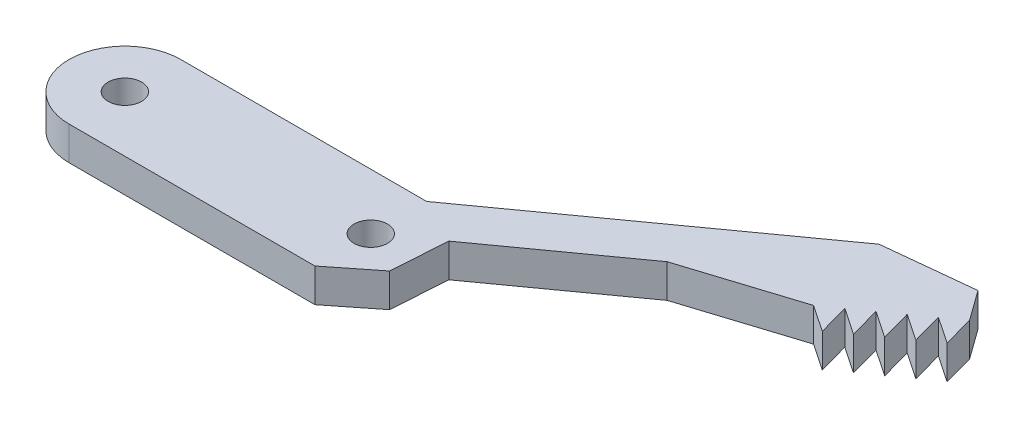
ISO-10303-21;
HEADER;
FILE_DESCRIPTION(('STEP AP214'),'2;1');
FILE_NAME('part.step','',(''),(''),'','','');
FILE_SCHEMA(('AUTOMOTIVE_DESIGN { 1 0 10303 214 1 1 1 1 }'));
ENDSEC;
DATA;
#1=APPLICATION_CONTEXT('core data for automotive mechanical design processes');
#2=APPLICATION_PROTOCOL_DEFINITION('international standard','automotive_design',2000,#1);
#3=PRODUCT_CONTEXT('',#1,'mechanical');
#4=PRODUCT('Part','Part','',(#3));
#5=PRODUCT_RELATED_PRODUCT_CATEGORY('part','',(#4));
#6=PRODUCT_DEFINITION_FORMATION('','',#4);
#7=PRODUCT_DEFINITION_CONTEXT('part definition',#1,'design');
#8=PRODUCT_DEFINITION('design','',#6,#7);
#9=PRODUCT_DEFINITION_SHAPE('','',#8);
#10=(LENGTH_UNIT() NAMED_UNIT(*) SI_UNIT(.MILLI.,.METRE.));
#11=(NAMED_UNIT(*) PLANE_ANGLE_UNIT() SI_UNIT($,.RADIAN.));
#12=(NAMED_UNIT(*) SI_UNIT($,.STERADIAN.) SOLID_ANGLE_UNIT());
#13=UNCERTAINTY_MEASURE_WITH_UNIT(LENGTH_MEASURE(1.E-05),#10,'distance_accuracy_value','');
#14=(GEOMETRIC_REPRESENTATION_CONTEXT(3) GLOBAL_UNCERTAINTY_ASSIGNED_CONTEXT((#13)) GLOBAL_UNIT_ASSIGNED_CONTEXT((#10,
#11,#12)) REPRESENTATION_CONTEXT('',''));
#15=CARTESIAN_POINT('',(0.,0.,0.));
#16=DIRECTION('',(0.,0.,1.));
#17=DIRECTION('',(1.,0.,0.));
#18=AXIS2_PLACEMENT_3D('',#15,#16,#17);
#19=CARTESIAN_POINT('',(-11.,3.,0.));
#20=DIRECTION('',(0.,1.,0.));
#21=DIRECTION('',(0.,0.,1.));
#22=AXIS2_PLACEMENT_3D('',#19,#20,#21);
#23=PLANE('',#22);
#24=DIRECTION('',(-0.783990131924299,0.,0.620773286349631));
#25=VECTOR('',#24,1.);
#26=CARTESIAN_POINT('',(14.7367715637288,3.,2.04117708948695));
#27=LINE('',#26,#25);
#28=CARTESIAN_POINT('',(14.7367715637288,3.,2.04117708948695));
#29=VERTEX_POINT('',#28);
#30=CARTESIAN_POINT('',(11.,3.,5.));
#31=VERTEX_POINT('',#30);
#32=EDGE_CURVE('E213',#29,#31,#27,.T.);
#33=ORIENTED_EDGE('',*,*,#32,.F.);
#34=DIRECTION('',(-0.0650802030381228,0.,0.99788003646356));
#35=VECTOR('',#34,1.);
#36=CARTESIAN_POINT('',(15.0602018848517,3.,-2.91800628070727));
#37=LINE('',#36,#35);
#38=CARTESIAN_POINT('',(15.0602018848517,3.,-2.91800628070727));
#39=VERTEX_POINT('',#38);
#40=EDGE_CURVE('E368',#39,#29,#37,.T.);
#41=ORIENTED_EDGE('',*,*,#40,.F.);
#42=DIRECTION('',(0.812040376970331,0.,-0.583601256141454));
#43=VECTOR('',#42,1.);
#44=CARTESIAN_POINT('',(26.4287671624363,3.,-11.0884238666876));
#45=LINE('',#44,#43);
#46=CARTESIAN_POINT('',(26.4287671624363,3.,-11.0884238666876));
#47=VERTEX_POINT('',#46);
#48=EDGE_CURVE('E250',#39,#47,#45,.T.);
#49=ORIENTED_EDGE('',*,*,#48,.T.);
#50=DIRECTION('',(0.952931648778246,0.,-0.303185211969141));
#51=VECTOR('',#50,1.);
#52=CARTESIAN_POINT('',(36.3694456881558,3.,-14.2511551389687));
#53=LINE('',#52,#51);
#54=CARTESIAN_POINT('',(36.3694456881558,3.,-14.2511551389687));
#55=VERTEX_POINT('',#54);
#56=EDGE_CURVE('E246',#47,#55,#53,.T.);
#57=ORIENTED_EDGE('',*,*,#56,.T.);
#58=DIRECTION('',(0.828855667469931,0.,0.559462494277298));
#59=VECTOR('',#58,1.);
#60=CARTESIAN_POINT('',(17.9920293321361,3.,-26.6555767969581));
#61=LINE('',#60,#59);
#62=CARTESIAN_POINT('',(38.7611027396135,3.,-12.6368301461159));
#63=VERTEX_POINT('',#62);
#64=EDGE_CURVE('E304',#55,#63,#61,.T.);
#65=ORIENTED_EDGE('',*,*,#64,.T.);
#66=DIRECTION('',(-0.266012204393938,0.,-0.963969660888494));
#67=VECTOR('',#66,1.);
#68=CARTESIAN_POINT('',(39.258703702402,3.,-10.8336338136397));
#69=LINE('',#68,#67);
#70=CARTESIAN_POINT('',(37.9935264420965,3.,-15.4183576512516));
#71=VERTEX_POINT('',#70);
#72=EDGE_CURVE('E328',#63,#71,#69,.T.);
#73=ORIENTED_EDGE('',*,*,#72,.T.);
#74=DIRECTION('',(0.828855667469931,0.,0.559462494277298));
#75=VECTOR('',#74,1.);
#76=CARTESIAN_POINT('',(19.0416115666688,3.,-28.2105553566772));
#77=LINE('',#76,#75);
#78=CARTESIAN_POINT('',(40.3851834935541,3.,-13.8040326583988));
#79=VERTEX_POINT('',#78);
#80=EDGE_CURVE('E332',#71,#79,#77,.T.);
#81=ORIENTED_EDGE('',*,*,#80,.T.);
#82=DIRECTION('',(-0.266012204393938,0.,-0.963969660888494));
#83=VECTOR('',#82,1.);
#84=CARTESIAN_POINT('',(41.0671635027396,3.,-11.3326872564651));
#85=LINE('',#84,#83);
#86=CARTESIAN_POINT('',(39.6176071960371,3.,-16.5855601635345));
#87=VERTEX_POINT('',#86);
#88=EDGE_CURVE('E305',#79,#87,#85,.T.);
#89=ORIENTED_EDGE('',*,*,#88,.T.);
#90=DIRECTION('',(0.828855667469931,0.,0.559462494277297));
#91=VECTOR('',#90,1.);
#92=CARTESIAN_POINT('',(20.0911938012014,3.,-29.7655339163963));
#93=LINE('',#92,#91);
#94=CARTESIAN_POINT('',(42.0092642474948,3.,-14.9712351706817));
#95=VERTEX_POINT('',#94);
#96=EDGE_CURVE('E284',#87,#95,#93,.T.);
#97=ORIENTED_EDGE('',*,*,#96,.T.);
#98=DIRECTION('',(-0.266012204393938,0.,-0.963969660888494));
#99=VECTOR('',#98,1.);
#100=CARTESIAN_POINT('',(42.8756233030771,3.,-11.8317406992905));
#101=LINE('',#100,#99);
#102=CARTESIAN_POINT('',(41.2416879499778,3.,-17.7527626758175));
#103=VERTEX_POINT('',#102);
#104=EDGE_CURVE('E346',#95,#103,#101,.T.);
#105=ORIENTED_EDGE('',*,*,#104,.T.);
#106=DIRECTION('',(0.828855667469931,0.,0.559462494277298));
#107=VECTOR('',#106,1.);
#108=CARTESIAN_POINT('',(21.1407760357342,3.,-31.3205124761154));
#109=LINE('',#108,#107);
#110=CARTESIAN_POINT('',(43.6333450014355,3.,-16.1384376829647));
#111=VERTEX_POINT('',#110);
#112=EDGE_CURVE('E350',#103,#111,#109,.T.);
#113=ORIENTED_EDGE('',*,*,#112,.T.);
#114=DIRECTION('',(-0.266012204393938,0.,-0.963969660888494));
#115=VECTOR('',#114,1.);
#116=CARTESIAN_POINT('',(44.6840831034147,3.,-12.3307941421158));
#117=LINE('',#116,#115);
#118=CARTESIAN_POINT('',(42.8657687039184,3.,-18.9199651881004));
#119=VERTEX_POINT('',#118);
#120=EDGE_CURVE('E285',#111,#119,#117,.T.);
#121=ORIENTED_EDGE('',*,*,#120,.T.);
#122=DIRECTION('',(0.828855667469932,0.,0.559462494277296));
#123=VECTOR('',#122,1.);
#124=CARTESIAN_POINT('',(22.1903582702668,3.,-32.8754910358345));
#125=LINE('',#124,#123);
#126=CARTESIAN_POINT('',(45.2574257553761,3.,-17.3056401952476));
#127=VERTEX_POINT('',#126);
#128=EDGE_CURVE('E289',#119,#127,#125,.T.);
#129=ORIENTED_EDGE('',*,*,#128,.T.);
#130=DIRECTION('',(-0.26601220439394,0.,-0.963969660888493));
#131=VECTOR('',#130,1.);
#132=CARTESIAN_POINT('',(46.4925429037522,3.,-12.8298475849413));
#133=LINE('',#132,#131);
#134=CARTESIAN_POINT('',(44.4898494578591,3.,-20.0871677003833));
#135=VERTEX_POINT('',#134);
#136=EDGE_CURVE('E361',#127,#135,#133,.T.);
#137=ORIENTED_EDGE('',*,*,#136,.T.);
#138=DIRECTION('',(-0.583601256141453,0.,-0.812040376970331));
#139=VECTOR('',#138,1.);
#140=CARTESIAN_POINT('',(40.2334535709319,3.,-26.0096452210923));
#141=LINE('',#140,#139);
#142=CARTESIAN_POINT('',(42.5678585954977,3.,-22.761483713211));
#143=VERTEX_POINT('',#142);
#144=EDGE_CURVE('E255',#135,#143,#141,.T.);
#145=ORIENTED_EDGE('',*,*,#144,.T.);
#146=DIRECTION('',(0.994595796078386,0.,-0.103822937847093));
#147=VECTOR('',#146,1.);
#148=CARTESIAN_POINT('',(42.5678585954977,3.,-22.761483713211));
#149=LINE('',#148,#147);
#150=CARTESIAN_POINT('',(34.5491709321396,3.,-21.9244364281022));
#151=VERTEX_POINT('',#150);
#152=EDGE_CURVE('E272',#151,#143,#149,.T.);
#153=ORIENTED_EDGE('',*,*,#152,.F.);
#154=DIRECTION('',(-0.812040376970331,0.,0.583601256141453));
#155=VECTOR('',#154,1.);
#156=CARTESIAN_POINT('',(11.,3.,-5.));
#157=LINE('',#156,#155);
#158=CARTESIAN_POINT('',(11.,3.,-5.));
#159=VERTEX_POINT('',#158);
#160=EDGE_CURVE('E253',#151,#159,#157,.T.);
#161=ORIENTED_EDGE('',*,*,#160,.T.);
#162=DIRECTION('',(-1.,0.,0.));
#163=VECTOR('',#162,1.);
#164=CARTESIAN_POINT('',(-11.,3.,-5.));
#165=LINE('',#164,#163);
#166=CARTESIAN_POINT('',(-11.,3.,-5.));
#167=VERTEX_POINT('',#166);
#168=EDGE_CURVE('E153',#159,#167,#165,.T.);
#169=ORIENTED_EDGE('',*,*,#168,.T.);
#170=CARTESIAN_POINT('',(-11.,3.,0.));
#171=DIRECTION('',(0.,1.,0.));
#172=DIRECTION('',(0.,0.,1.));
#173=AXIS2_PLACEMENT_3D('',#170,#171,#172);
#174=CIRCLE('',#173,5.);
#175=CARTESIAN_POINT('',(-11.,3.,5.));
#176=VERTEX_POINT('',#175);
#177=EDGE_CURVE('E180',#167,#176,#174,.T.);
#178=ORIENTED_EDGE('',*,*,#177,.T.);
#179=DIRECTION('',(1.,0.,0.));
#180=VECTOR('',#179,1.);
#181=CARTESIAN_POINT('',(-11.,3.,5.));
#182=LINE('',#181,#180);
#183=EDGE_CURVE('E224',#176,#31,#182,.T.);
#184=ORIENTED_EDGE('',*,*,#183,.T.);
#185=EDGE_LOOP('',(#33,#41,#49,#57,#65,#73,#81,#89,#97,#105,#113,#121,#129,#137,#145,#153,#161,
#169,#178,#184));
#186=FACE_BOUND('',#185,.T.);
#187=CARTESIAN_POINT('',(-11.,3.,0.));
#188=DIRECTION('',(0.,1.,0.));
#189=DIRECTION('',(0.,0.,1.));
#190=AXIS2_PLACEMENT_3D('',#187,#188,#189);
#191=CIRCLE('',#190,1.5);
#192=CARTESIAN_POINT('',(-11.,3.,1.5));
#193=VERTEX_POINT('',#192);
#194=EDGE_CURVE('E192',#193,#193,#191,.T.);
#195=ORIENTED_EDGE('',*,*,#194,.F.);
#196=EDGE_LOOP('',(#195));
#197=FACE_BOUND('',#196,.T.);
#198=CARTESIAN_POINT('',(11.,3.,0.));
#199=DIRECTION('',(0.,1.,0.));
#200=DIRECTION('',(0.,0.,1.));
#201=AXIS2_PLACEMENT_3D('',#198,#199,#200);
#202=CIRCLE('',#201,1.5);
#203=CARTESIAN_POINT('',(11.,3.,1.5));
#204=VERTEX_POINT('',#203);
#205=EDGE_CURVE('E229',#204,#204,#202,.T.);
#206=ORIENTED_EDGE('',*,*,#205,.F.);
#207=EDGE_LOOP('',(#206));
#208=FACE_BOUND('',#207,.T.);
#209=ADVANCED_FACE('F129',(#186,#197,#208),#23,.T.);
#210=CARTESIAN_POINT('',(-11.,0.,0.));
#211=DIRECTION('',(0.,1.,0.));
#212=DIRECTION('',(0.,0.,1.));
#213=AXIS2_PLACEMENT_3D('',#210,#211,#212);
#214=PLANE('',#213);
#215=CARTESIAN_POINT('',(-11.,0.,0.));
#216=DIRECTION('',(0.,1.,0.));
#217=DIRECTION('',(0.,0.,1.));
#218=AXIS2_PLACEMENT_3D('',#215,#216,#217);
#219=CIRCLE('',#218,1.5);
#220=CARTESIAN_POINT('',(-11.,0.,1.5));
#221=VERTEX_POINT('',#220);
#222=EDGE_CURVE('E196',#221,#221,#219,.T.);
#223=ORIENTED_EDGE('',*,*,#222,.T.);
#224=EDGE_LOOP('',(#223));
#225=FACE_BOUND('',#224,.T.);
#226=CARTESIAN_POINT('',(11.,0.,0.));
#227=DIRECTION('',(0.,1.,0.));
#228=DIRECTION('',(0.,0.,1.));
#229=AXIS2_PLACEMENT_3D('',#226,#227,#228);
#230=CIRCLE('',#229,1.5);
#231=CARTESIAN_POINT('',(11.,0.,1.5));
#232=VERTEX_POINT('',#231);
#233=EDGE_CURVE('E231',#232,#232,#230,.T.);
#234=ORIENTED_EDGE('',*,*,#233,.T.);
#235=EDGE_LOOP('',(#234));
#236=FACE_BOUND('',#235,.T.);
#237=DIRECTION('',(-0.0650802030381228,0.,0.99788003646356));
#238=VECTOR('',#237,1.);
#239=CARTESIAN_POINT('',(15.0602018848517,0.,-2.91800628070727));
#240=LINE('',#239,#238);
#241=CARTESIAN_POINT('',(15.0602018848517,0.,-2.91800628070727));
#242=VERTEX_POINT('',#241);
#243=CARTESIAN_POINT('',(14.7367715637288,0.,2.04117708948695));
#244=VERTEX_POINT('',#243);
#245=EDGE_CURVE('E220',#242,#244,#240,.T.);
#246=ORIENTED_EDGE('',*,*,#245,.T.);
#247=DIRECTION('',(-0.783990131924299,0.,0.620773286349631));
#248=VECTOR('',#247,1.);
#249=CARTESIAN_POINT('',(14.7367715637288,0.,2.04117708948695));
#250=LINE('',#249,#248);
#251=CARTESIAN_POINT('',(11.,0.,5.));
#252=VERTEX_POINT('',#251);
#253=EDGE_CURVE('E210',#244,#252,#250,.T.);
#254=ORIENTED_EDGE('',*,*,#253,.T.);
#255=DIRECTION('',(1.,0.,0.));
#256=VECTOR('',#255,1.);
#257=CARTESIAN_POINT('',(-11.,0.,5.));
#258=LINE('',#257,#256);
#259=CARTESIAN_POINT('',(-11.,0.,5.));
#260=VERTEX_POINT('',#259);
#261=EDGE_CURVE('E181',#260,#252,#258,.T.);
#262=ORIENTED_EDGE('',*,*,#261,.F.);
#263=CARTESIAN_POINT('',(-11.,0.,0.));
#264=DIRECTION('',(0.,1.,0.));
#265=DIRECTION('',(0.,0.,1.));
#266=AXIS2_PLACEMENT_3D('',#263,#264,#265);
#267=CIRCLE('',#266,5.);
#268=CARTESIAN_POINT('',(-11.,0.,-5.));
#269=VERTEX_POINT('',#268);
#270=EDGE_CURVE('E186',#269,#260,#267,.T.);
#271=ORIENTED_EDGE('',*,*,#270,.F.);
#272=DIRECTION('',(-1.,0.,0.));
#273=VECTOR('',#272,1.);
#274=CARTESIAN_POINT('',(-11.,0.,-5.));
#275=LINE('',#274,#273);
#276=CARTESIAN_POINT('',(11.,0.,-5.));
#277=VERTEX_POINT('',#276);
#278=EDGE_CURVE('E170',#277,#269,#275,.T.);
#279=ORIENTED_EDGE('',*,*,#278,.F.);
#280=DIRECTION('',(-0.812040376970331,0.,0.583601256141453));
#281=VECTOR('',#280,1.);
#282=CARTESIAN_POINT('',(11.,0.,-5.));
#283=LINE('',#282,#281);
#284=CARTESIAN_POINT('',(34.5491709321396,0.,-21.9244364281022));
#285=VERTEX_POINT('',#284);
#286=EDGE_CURVE('E264',#285,#277,#283,.T.);
#287=ORIENTED_EDGE('',*,*,#286,.F.);
#288=DIRECTION('',(0.994595796078386,0.,-0.103822937847093));
#289=VECTOR('',#288,1.);
#290=CARTESIAN_POINT('',(42.5678585954977,0.,-22.761483713211));
#291=LINE('',#290,#289);
#292=CARTESIAN_POINT('',(42.5678585954977,0.,-22.761483713211));
#293=VERTEX_POINT('',#292);
#294=EDGE_CURVE('E144',#285,#293,#291,.T.);
#295=ORIENTED_EDGE('',*,*,#294,.T.);
#296=DIRECTION('',(-0.583601256141453,0.,-0.812040376970331));
#297=VECTOR('',#296,1.);
#298=CARTESIAN_POINT('',(40.2334535709319,0.,-26.0096452210923));
#299=LINE('',#298,#297);
#300=CARTESIAN_POINT('',(44.4898494578591,0.,-20.0871677003833));
#301=VERTEX_POINT('',#300);
#302=EDGE_CURVE('E249',#301,#293,#299,.T.);
#303=ORIENTED_EDGE('',*,*,#302,.F.);
#304=DIRECTION('',(-0.26601220439394,0.,-0.963969660888493));
#305=VECTOR('',#304,1.);
#306=CARTESIAN_POINT('',(46.4925429037522,0.,-12.8298475849413));
#307=LINE('',#306,#305);
#308=CARTESIAN_POINT('',(45.2574257553761,0.,-17.3056401952476));
#309=VERTEX_POINT('',#308);
#310=EDGE_CURVE('E360',#309,#301,#307,.T.);
#311=ORIENTED_EDGE('',*,*,#310,.F.);
#312=DIRECTION('',(0.828855667469932,0.,0.559462494277296));
#313=VECTOR('',#312,1.);
#314=CARTESIAN_POINT('',(22.1903582702668,0.,-32.8754910358345));
#315=LINE('',#314,#313);
#316=CARTESIAN_POINT('',(42.8657687039184,0.,-18.9199651881004));
#317=VERTEX_POINT('',#316);
#318=EDGE_CURVE('E288',#317,#309,#315,.T.);
#319=ORIENTED_EDGE('',*,*,#318,.F.);
#320=DIRECTION('',(-0.266012204393938,0.,-0.963969660888494));
#321=VECTOR('',#320,1.);
#322=CARTESIAN_POINT('',(44.6840831034147,0.,-12.3307941421158));
#323=LINE('',#322,#321);
#324=CARTESIAN_POINT('',(43.6333450014355,0.,-16.1384376829647));
#325=VERTEX_POINT('',#324);
#326=EDGE_CURVE('E281',#325,#317,#323,.T.);
#327=ORIENTED_EDGE('',*,*,#326,.F.);
#328=DIRECTION('',(0.828855667469931,0.,0.559462494277298));
#329=VECTOR('',#328,1.);
#330=CARTESIAN_POINT('',(21.1407760357342,0.,-31.3205124761154));
#331=LINE('',#330,#329);
#332=CARTESIAN_POINT('',(41.2416879499778,0.,-17.7527626758175));
#333=VERTEX_POINT('',#332);
#334=EDGE_CURVE('E349',#333,#325,#331,.T.);
#335=ORIENTED_EDGE('',*,*,#334,.F.);
#336=DIRECTION('',(-0.266012204393938,0.,-0.963969660888494));
#337=VECTOR('',#336,1.);
#338=CARTESIAN_POINT('',(42.8756233030771,0.,-11.8317406992905));
#339=LINE('',#338,#337);
#340=CARTESIAN_POINT('',(42.0092642474948,0.,-14.9712351706817));
#341=VERTEX_POINT('',#340);
#342=EDGE_CURVE('E343',#341,#333,#339,.T.);
#343=ORIENTED_EDGE('',*,*,#342,.F.);
#344=DIRECTION('',(0.828855667469931,0.,0.559462494277297));
#345=VECTOR('',#344,1.);
#346=CARTESIAN_POINT('',(20.0911938012014,0.,-29.7655339163963));
#347=LINE('',#346,#345);
#348=CARTESIAN_POINT('',(39.6176071960371,0.,-16.5855601635345));
#349=VERTEX_POINT('',#348);
#350=EDGE_CURVE('E308',#349,#341,#347,.T.);
#351=ORIENTED_EDGE('',*,*,#350,.F.);
#352=DIRECTION('',(-0.266012204393938,0.,-0.963969660888494));
#353=VECTOR('',#352,1.);
#354=CARTESIAN_POINT('',(41.0671635027396,0.,-11.3326872564651));
#355=LINE('',#354,#353);
#356=CARTESIAN_POINT('',(40.3851834935541,0.,-13.8040326583988));
#357=VERTEX_POINT('',#356);
#358=EDGE_CURVE('E301',#357,#349,#355,.T.);
#359=ORIENTED_EDGE('',*,*,#358,.F.);
#360=DIRECTION('',(0.828855667469931,0.,0.559462494277298));
#361=VECTOR('',#360,1.);
#362=CARTESIAN_POINT('',(19.0416115666688,0.,-28.2105553566772));
#363=LINE('',#362,#361);
#364=CARTESIAN_POINT('',(37.9935264420965,0.,-15.4183576512516));
#365=VERTEX_POINT('',#364);
#366=EDGE_CURVE('E331',#365,#357,#363,.T.);
#367=ORIENTED_EDGE('',*,*,#366,.F.);
#368=DIRECTION('',(-0.266012204393938,0.,-0.963969660888494));
#369=VECTOR('',#368,1.);
#370=CARTESIAN_POINT('',(39.258703702402,0.,-10.8336338136397));
#371=LINE('',#370,#369);
#372=CARTESIAN_POINT('',(38.7611027396135,0.,-12.6368301461159));
#373=VERTEX_POINT('',#372);
#374=EDGE_CURVE('E325',#373,#365,#371,.T.);
#375=ORIENTED_EDGE('',*,*,#374,.F.);
#376=DIRECTION('',(0.828855667469931,0.,0.559462494277298));
#377=VECTOR('',#376,1.);
#378=CARTESIAN_POINT('',(17.9920293321361,0.,-26.6555767969581));
#379=LINE('',#378,#377);
#380=CARTESIAN_POINT('',(36.3694456881558,0.,-14.2511551389687));
#381=VERTEX_POINT('',#380);
#382=EDGE_CURVE('E317',#381,#373,#379,.T.);
#383=ORIENTED_EDGE('',*,*,#382,.F.);
#384=DIRECTION('',(0.952931648778246,0.,-0.303185211969141));
#385=VECTOR('',#384,1.);
#386=CARTESIAN_POINT('',(36.3694456881558,0.,-14.2511551389687));
#387=LINE('',#386,#385);
#388=CARTESIAN_POINT('',(26.4287671624363,0.,-11.0884238666876));
#389=VERTEX_POINT('',#388);
#390=EDGE_CURVE('E241',#389,#381,#387,.T.);
#391=ORIENTED_EDGE('',*,*,#390,.F.);
#392=DIRECTION('',(0.812040376970331,0.,-0.583601256141454));
#393=VECTOR('',#392,1.);
#394=CARTESIAN_POINT('',(26.4287671624363,0.,-11.0884238666876));
#395=LINE('',#394,#393);
#396=EDGE_CURVE('E261',#242,#389,#395,.T.);
#397=ORIENTED_EDGE('',*,*,#396,.F.);
#398=EDGE_LOOP('',(#246,#254,#262,#271,#279,#287,#295,#303,#311,#319,#327,#335,#343,#351,#359,
#367,#375,#383,#391,#397));
#399=FACE_BOUND('',#398,.T.);
#400=ADVANCED_FACE('F189',(#225,#236,#399),#214,.F.);
#401=CARTESIAN_POINT('',(40.2334535709319,0.,-26.0096452210923));
#402=DIRECTION('',(0.812040376970331,0.,-0.583601256141453));
#403=DIRECTION('',(-0.583601256141454,0.,-0.812040376970331));
#404=AXIS2_PLACEMENT_3D('',#401,#402,#403);
#405=PLANE('',#404);
#406=ORIENTED_EDGE('',*,*,#144,.F.);
#407=DIRECTION('',(0.,1.,0.));
#408=VECTOR('',#407,1.);
#409=CARTESIAN_POINT('',(44.4898494578591,0.,-20.0871677003833));
#410=LINE('',#409,#408);
#411=EDGE_CURVE('E353',#301,#135,#410,.T.);
#412=ORIENTED_EDGE('',*,*,#411,.F.);
#413=ORIENTED_EDGE('',*,*,#302,.T.);
#414=DIRECTION('',(0.,1.,0.));
#415=VECTOR('',#414,1.);
#416=CARTESIAN_POINT('',(42.5678585954977,0.,-22.761483713211));
#417=LINE('',#416,#415);
#418=EDGE_CURVE('E268',#293,#143,#417,.T.);
#419=ORIENTED_EDGE('',*,*,#418,.T.);
#420=EDGE_LOOP('',(#406,#412,#413,#419));
#421=FACE_BOUND('',#420,.T.);
#422=ADVANCED_FACE('F514',(#421),#405,.T.);
#423=CARTESIAN_POINT('',(-11.,3.,0.));
#424=DIRECTION('',(0.,-1.,0.));
#425=DIRECTION('',(0.,0.,-1.));
#426=AXIS2_PLACEMENT_3D('',#423,#424,#425);
#427=CYLINDRICAL_SURFACE('',#426,5.);
#428=ORIENTED_EDGE('',*,*,#270,.T.);
#429=DIRECTION('',(0.,-1.,0.));
#430=VECTOR('',#429,1.);
#431=CARTESIAN_POINT('',(-11.,3.,5.));
#432=LINE('',#431,#430);
#433=EDGE_CURVE('E12',#176,#260,#432,.T.);
#434=ORIENTED_EDGE('',*,*,#433,.F.);
#435=ORIENTED_EDGE('',*,*,#177,.F.);
#436=DIRECTION('',(0.,-1.,0.));
#437=VECTOR('',#436,1.);
#438=CARTESIAN_POINT('',(-11.,3.,-5.));
#439=LINE('',#438,#437);
#440=EDGE_CURVE('E173',#167,#269,#439,.T.);
#441=ORIENTED_EDGE('',*,*,#440,.T.);
#442=EDGE_LOOP('',(#428,#434,#435,#441));
#443=FACE_BOUND('',#442,.T.);
#444=ADVANCED_FACE('F131',(#443),#427,.T.);
#445=CARTESIAN_POINT('',(-11.,3.,5.));
#446=DIRECTION('',(0.,0.,-1.));
#447=DIRECTION('',(-1.,0.,0.));
#448=AXIS2_PLACEMENT_3D('',#445,#446,#447);
#449=PLANE('',#448);
#450=ORIENTED_EDGE('',*,*,#261,.T.);
#451=DIRECTION('',(0.,-1.,0.));
#452=VECTOR('',#451,1.);
#453=CARTESIAN_POINT('',(11.,3.,5.));
#454=LINE('',#453,#452);
#455=EDGE_CURVE('E137',#31,#252,#454,.T.);
#456=ORIENTED_EDGE('',*,*,#455,.F.);
#457=ORIENTED_EDGE('',*,*,#183,.F.);
#458=ORIENTED_EDGE('',*,*,#433,.T.);
#459=EDGE_LOOP('',(#450,#456,#457,#458));
#460=FACE_BOUND('',#459,.T.);
#461=ADVANCED_FACE('F223',(#460),#449,.F.);
#462=CARTESIAN_POINT('',(-11.,3.,-5.));
#463=DIRECTION('',(0.,0.,1.));
#464=DIRECTION('',(1.,0.,0.));
#465=AXIS2_PLACEMENT_3D('',#462,#463,#464);
#466=PLANE('',#465);
#467=ORIENTED_EDGE('',*,*,#278,.T.);
#468=ORIENTED_EDGE('',*,*,#440,.F.);
#469=ORIENTED_EDGE('',*,*,#168,.F.);
#470=DIRECTION('',(0.,-1.,0.));
#471=VECTOR('',#470,1.);
#472=CARTESIAN_POINT('',(11.,3.,-5.));
#473=LINE('',#472,#471);
#474=EDGE_CURVE('E176',#159,#277,#473,.T.);
#475=ORIENTED_EDGE('',*,*,#474,.T.);
#476=EDGE_LOOP('',(#467,#468,#469,#475));
#477=FACE_BOUND('',#476,.T.);
#478=ADVANCED_FACE('F172',(#477),#466,.F.);
#479=CARTESIAN_POINT('',(-11.,3.,0.));
#480=DIRECTION('',(0.,-1.,0.));
#481=DIRECTION('',(0.,0.,-1.));
#482=AXIS2_PLACEMENT_3D('',#479,#480,#481);
#483=CYLINDRICAL_SURFACE('',#482,1.5);
#484=ORIENTED_EDGE('',*,*,#194,.T.);
#485=EDGE_LOOP('',(#484));
#486=FACE_BOUND('',#485,.T.);
#487=ORIENTED_EDGE('',*,*,#222,.F.);
#488=EDGE_LOOP('',(#487));
#489=FACE_BOUND('',#488,.T.);
#490=ADVANCED_FACE('F518',(#486,#489),#483,.F.);
#491=CARTESIAN_POINT('',(11.,3.,0.));
#492=DIRECTION('',(0.,-1.,0.));
#493=DIRECTION('',(0.,0.,-1.));
#494=AXIS2_PLACEMENT_3D('',#491,#492,#493);
#495=CYLINDRICAL_SURFACE('',#494,1.5);
#496=ORIENTED_EDGE('',*,*,#205,.T.);
#497=EDGE_LOOP('',(#496));
#498=FACE_BOUND('',#497,.T.);
#499=ORIENTED_EDGE('',*,*,#233,.F.);
#500=EDGE_LOOP('',(#499));
#501=FACE_BOUND('',#500,.T.);
#502=ADVANCED_FACE('F536',(#498,#501),#495,.F.);
#503=CARTESIAN_POINT('',(36.3694456881558,0.,-14.2511551389687));
#504=DIRECTION('',(0.303185211969141,0.,0.952931648778246));
#505=DIRECTION('',(0.952931648778246,0.,-0.303185211969142));
#506=AXIS2_PLACEMENT_3D('',#503,#504,#505);
#507=PLANE('',#506);
#508=ORIENTED_EDGE('',*,*,#56,.F.);
#509=DIRECTION('',(0.,1.,0.));
#510=VECTOR('',#509,1.);
#511=CARTESIAN_POINT('',(26.4287671624363,0.,-11.0884238666876));
#512=LINE('',#511,#510);
#513=EDGE_CURVE('E240',#389,#47,#512,.T.);
#514=ORIENTED_EDGE('',*,*,#513,.F.);
#515=ORIENTED_EDGE('',*,*,#390,.T.);
#516=DIRECTION('',(0.,1.,0.));
#517=VECTOR('',#516,1.);
#518=CARTESIAN_POINT('',(36.3694456881558,0.,-14.2511551389687));
#519=LINE('',#518,#517);
#520=EDGE_CURVE('E234',#381,#55,#519,.T.);
#521=ORIENTED_EDGE('',*,*,#520,.T.);
#522=EDGE_LOOP('',(#508,#514,#515,#521));
#523=FACE_BOUND('',#522,.T.);
#524=ADVANCED_FACE('F392',(#523),#507,.T.);
#525=CARTESIAN_POINT('',(26.4287671624363,0.,-11.0884238666876));
#526=DIRECTION('',(0.583601256141454,0.,0.812040376970331));
#527=DIRECTION('',(0.812040376970331,0.,-0.583601256141454));
#528=AXIS2_PLACEMENT_3D('',#525,#526,#527);
#529=PLANE('',#528);
#530=ORIENTED_EDGE('',*,*,#48,.F.);
#531=DIRECTION('',(0.,1.,0.));
#532=VECTOR('',#531,1.);
#533=CARTESIAN_POINT('',(15.0602018848517,0.,-2.91800628070727));
#534=LINE('',#533,#532);
#535=EDGE_CURVE('E237',#242,#39,#534,.T.);
#536=ORIENTED_EDGE('',*,*,#535,.F.);
#537=ORIENTED_EDGE('',*,*,#396,.T.);
#538=ORIENTED_EDGE('',*,*,#513,.T.);
#539=EDGE_LOOP('',(#530,#536,#537,#538));
#540=FACE_BOUND('',#539,.T.);
#541=ADVANCED_FACE('F383',(#540),#529,.T.);
#542=CARTESIAN_POINT('',(11.,0.,-5.));
#543=DIRECTION('',(-0.583601256141453,0.,-0.812040376970331));
#544=DIRECTION('',(-0.812040376970331,0.,0.583601256141454));
#545=AXIS2_PLACEMENT_3D('',#542,#543,#544);
#546=PLANE('',#545);
#547=DIRECTION('',(0.,1.,0.));
#548=VECTOR('',#547,1.);
#549=CARTESIAN_POINT('',(34.5491709321396,0.,-21.9244364281022));
#550=LINE('',#549,#548);
#551=EDGE_CURVE('E258',#285,#151,#550,.T.);
#552=ORIENTED_EDGE('',*,*,#551,.F.);
#553=ORIENTED_EDGE('',*,*,#286,.T.);
#554=ORIENTED_EDGE('',*,*,#474,.F.);
#555=ORIENTED_EDGE('',*,*,#160,.F.);
#556=EDGE_LOOP('',(#552,#553,#554,#555));
#557=FACE_BOUND('',#556,.T.);
#558=ADVANCED_FACE('F505',(#557),#546,.T.);
#559=CARTESIAN_POINT('',(42.5678585954977,0.,-22.761483713211));
#560=DIRECTION('',(0.103822937847093,0.,0.994595796078386));
#561=DIRECTION('',(0.994595796078386,0.,-0.103822937847093));
#562=AXIS2_PLACEMENT_3D('',#559,#560,#561);
#563=PLANE('',#562);
#564=ORIENTED_EDGE('',*,*,#152,.T.);
#565=ORIENTED_EDGE('',*,*,#418,.F.);
#566=ORIENTED_EDGE('',*,*,#294,.F.);
#567=ORIENTED_EDGE('',*,*,#551,.T.);
#568=EDGE_LOOP('',(#564,#565,#566,#567));
#569=FACE_BOUND('',#568,.T.);
#570=ADVANCED_FACE('F498',(#569),#563,.F.);
#571=CARTESIAN_POINT('',(17.9920293321361,0.,-26.6555767969581));
#572=DIRECTION('',(-0.559462494277298,0.,0.828855667469931));
#573=DIRECTION('',(0.828855667469931,0.,0.559462494277298));
#574=AXIS2_PLACEMENT_3D('',#571,#572,#573);
#575=PLANE('',#574);
#576=ORIENTED_EDGE('',*,*,#64,.F.);
#577=ORIENTED_EDGE('',*,*,#520,.F.);
#578=ORIENTED_EDGE('',*,*,#382,.T.);
#579=DIRECTION('',(0.,1.,0.));
#580=VECTOR('',#579,1.);
#581=CARTESIAN_POINT('',(38.7611027396135,0.,-12.6368301461159));
#582=LINE('',#581,#580);
#583=EDGE_CURVE('E275',#373,#63,#582,.T.);
#584=ORIENTED_EDGE('',*,*,#583,.T.);
#585=EDGE_LOOP('',(#576,#577,#578,#584));
#586=FACE_BOUND('',#585,.T.);
#587=ADVANCED_FACE('F496',(#586),#575,.T.);
#588=CARTESIAN_POINT('',(22.1903582702668,0.,-32.8754910358345));
#589=DIRECTION('',(-0.559462494277296,0.,0.828855667469932));
#590=DIRECTION('',(0.828855667469932,0.,0.559462494277296));
#591=AXIS2_PLACEMENT_3D('',#588,#589,#590);
#592=PLANE('',#591);
#593=ORIENTED_EDGE('',*,*,#128,.F.);
#594=DIRECTION('',(0.,1.,0.));
#595=VECTOR('',#594,1.);
#596=CARTESIAN_POINT('',(42.8657687039184,0.,-18.9199651881004));
#597=LINE('',#596,#595);
#598=EDGE_CURVE('E277',#317,#119,#597,.T.);
#599=ORIENTED_EDGE('',*,*,#598,.F.);
#600=ORIENTED_EDGE('',*,*,#318,.T.);
#601=DIRECTION('',(0.,1.,0.));
#602=VECTOR('',#601,1.);
#603=CARTESIAN_POINT('',(45.2574257553761,0.,-17.3056401952476));
#604=LINE('',#603,#602);
#605=EDGE_CURVE('E280',#309,#127,#604,.T.);
#606=ORIENTED_EDGE('',*,*,#605,.T.);
#607=EDGE_LOOP('',(#593,#599,#600,#606));
#608=FACE_BOUND('',#607,.T.);
#609=ADVANCED_FACE('F464',(#608),#592,.T.);
#610=CARTESIAN_POINT('',(44.6840831034147,0.,-12.3307941421158));
#611=DIRECTION('',(0.963969660888494,0.,-0.266012204393938));
#612=DIRECTION('',(-0.266012204393938,0.,-0.963969660888494));
#613=AXIS2_PLACEMENT_3D('',#610,#611,#612);
#614=PLANE('',#613);
#615=ORIENTED_EDGE('',*,*,#120,.F.);
#616=DIRECTION('',(0.,1.,0.));
#617=VECTOR('',#616,1.);
#618=CARTESIAN_POINT('',(43.6333450014355,0.,-16.1384376829647));
#619=LINE('',#618,#617);
#620=EDGE_CURVE('E335',#325,#111,#619,.T.);
#621=ORIENTED_EDGE('',*,*,#620,.F.);
#622=ORIENTED_EDGE('',*,*,#326,.T.);
#623=ORIENTED_EDGE('',*,*,#598,.T.);
#624=EDGE_LOOP('',(#615,#621,#622,#623));
#625=FACE_BOUND('',#624,.T.);
#626=ADVANCED_FACE('F467',(#625),#614,.T.);
#627=CARTESIAN_POINT('',(20.0911938012014,0.,-29.7655339163963));
#628=DIRECTION('',(-0.559462494277297,0.,0.828855667469931));
#629=DIRECTION('',(0.828855667469932,0.,0.559462494277297));
#630=AXIS2_PLACEMENT_3D('',#627,#628,#629);
#631=PLANE('',#630);
#632=ORIENTED_EDGE('',*,*,#96,.F.);
#633=DIRECTION('',(0.,1.,0.));
#634=VECTOR('',#633,1.);
#635=CARTESIAN_POINT('',(39.6176071960371,0.,-16.5855601635345));
#636=LINE('',#635,#634);
#637=EDGE_CURVE('E297',#349,#87,#636,.T.);
#638=ORIENTED_EDGE('',*,*,#637,.F.);
#639=ORIENTED_EDGE('',*,*,#350,.T.);
#640=DIRECTION('',(0.,1.,0.));
#641=VECTOR('',#640,1.);
#642=CARTESIAN_POINT('',(42.0092642474948,0.,-14.9712351706817));
#643=LINE('',#642,#641);
#644=EDGE_CURVE('E300',#341,#95,#643,.T.);
#645=ORIENTED_EDGE('',*,*,#644,.T.);
#646=EDGE_LOOP('',(#632,#638,#639,#645));
#647=FACE_BOUND('',#646,.T.);
#648=ADVANCED_FACE('F480',(#647),#631,.T.);
#649=CARTESIAN_POINT('',(41.0671635027396,0.,-11.3326872564651));
#650=DIRECTION('',(0.963969660888494,0.,-0.266012204393938));
#651=DIRECTION('',(-0.266012204393938,0.,-0.963969660888494));
#652=AXIS2_PLACEMENT_3D('',#649,#650,#651);
#653=PLANE('',#652);
#654=ORIENTED_EDGE('',*,*,#88,.F.);
#655=DIRECTION('',(0.,1.,0.));
#656=VECTOR('',#655,1.);
#657=CARTESIAN_POINT('',(40.3851834935541,0.,-13.8040326583988));
#658=LINE('',#657,#656);
#659=EDGE_CURVE('E292',#357,#79,#658,.T.);
#660=ORIENTED_EDGE('',*,*,#659,.F.);
#661=ORIENTED_EDGE('',*,*,#358,.T.);
#662=ORIENTED_EDGE('',*,*,#637,.T.);
#663=EDGE_LOOP('',(#654,#660,#661,#662));
#664=FACE_BOUND('',#663,.T.);
#665=ADVANCED_FACE('F486',(#664),#653,.T.);
#666=CARTESIAN_POINT('',(19.0416115666688,0.,-28.2105553566772));
#667=DIRECTION('',(-0.559462494277298,0.,0.828855667469931));
#668=DIRECTION('',(0.828855667469931,0.,0.559462494277298));
#669=AXIS2_PLACEMENT_3D('',#666,#667,#668);
#670=PLANE('',#669);
#671=ORIENTED_EDGE('',*,*,#80,.F.);
#672=DIRECTION('',(0.,1.,0.));
#673=VECTOR('',#672,1.);
#674=CARTESIAN_POINT('',(37.9935264420965,0.,-15.4183576512516));
#675=LINE('',#674,#673);
#676=EDGE_CURVE('E322',#365,#71,#675,.T.);
#677=ORIENTED_EDGE('',*,*,#676,.F.);
#678=ORIENTED_EDGE('',*,*,#366,.T.);
#679=ORIENTED_EDGE('',*,*,#659,.T.);
#680=EDGE_LOOP('',(#671,#677,#678,#679));
#681=FACE_BOUND('',#680,.T.);
#682=ADVANCED_FACE('F493',(#681),#670,.T.);
#683=CARTESIAN_POINT('',(39.258703702402,0.,-10.8336338136397));
#684=DIRECTION('',(0.963969660888494,0.,-0.266012204393938));
#685=DIRECTION('',(-0.266012204393938,0.,-0.963969660888494));
#686=AXIS2_PLACEMENT_3D('',#683,#684,#685);
#687=PLANE('',#686);
#688=ORIENTED_EDGE('',*,*,#72,.F.);
#689=ORIENTED_EDGE('',*,*,#583,.F.);
#690=ORIENTED_EDGE('',*,*,#374,.T.);
#691=ORIENTED_EDGE('',*,*,#676,.T.);
#692=EDGE_LOOP('',(#688,#689,#690,#691));
#693=FACE_BOUND('',#692,.T.);
#694=ADVANCED_FACE('F495',(#693),#687,.T.);
#695=CARTESIAN_POINT('',(21.1407760357342,0.,-31.3205124761154));
#696=DIRECTION('',(-0.559462494277298,0.,0.828855667469931));
#697=DIRECTION('',(0.828855667469931,0.,0.559462494277298));
#698=AXIS2_PLACEMENT_3D('',#695,#696,#697);
#699=PLANE('',#698);
#700=ORIENTED_EDGE('',*,*,#112,.F.);
#701=DIRECTION('',(0.,1.,0.));
#702=VECTOR('',#701,1.);
#703=CARTESIAN_POINT('',(41.2416879499778,0.,-17.7527626758175));
#704=LINE('',#703,#702);
#705=EDGE_CURVE('E340',#333,#103,#704,.T.);
#706=ORIENTED_EDGE('',*,*,#705,.F.);
#707=ORIENTED_EDGE('',*,*,#334,.T.);
#708=ORIENTED_EDGE('',*,*,#620,.T.);
#709=EDGE_LOOP('',(#700,#706,#707,#708));
#710=FACE_BOUND('',#709,.T.);
#711=ADVANCED_FACE('F475',(#710),#699,.T.);
#712=CARTESIAN_POINT('',(42.8756233030771,0.,-11.8317406992905));
#713=DIRECTION('',(0.963969660888494,0.,-0.266012204393938));
#714=DIRECTION('',(-0.266012204393938,0.,-0.963969660888494));
#715=AXIS2_PLACEMENT_3D('',#712,#713,#714);
#716=PLANE('',#715);
#717=ORIENTED_EDGE('',*,*,#104,.F.);
#718=ORIENTED_EDGE('',*,*,#644,.F.);
#719=ORIENTED_EDGE('',*,*,#342,.T.);
#720=ORIENTED_EDGE('',*,*,#705,.T.);
#721=EDGE_LOOP('',(#717,#718,#719,#720));
#722=FACE_BOUND('',#721,.T.);
#723=ADVANCED_FACE('F477',(#722),#716,.T.);
#724=CARTESIAN_POINT('',(46.4925429037522,0.,-12.8298475849413));
#725=DIRECTION('',(0.963969660888493,0.,-0.26601220439394));
#726=DIRECTION('',(-0.26601220439394,0.,-0.963969660888493));
#727=AXIS2_PLACEMENT_3D('',#724,#725,#726);
#728=PLANE('',#727);
#729=ORIENTED_EDGE('',*,*,#136,.F.);
#730=ORIENTED_EDGE('',*,*,#605,.F.);
#731=ORIENTED_EDGE('',*,*,#310,.T.);
#732=ORIENTED_EDGE('',*,*,#411,.T.);
#733=EDGE_LOOP('',(#729,#730,#731,#732));
#734=FACE_BOUND('',#733,.T.);
#735=ADVANCED_FACE('F456',(#734),#728,.T.);
#736=CARTESIAN_POINT('',(14.7367715637288,0.,2.04117708948695));
#737=DIRECTION('',(-0.620773286349631,0.,-0.783990131924299));
#738=DIRECTION('',(-0.783990131924299,0.,0.620773286349631));
#739=AXIS2_PLACEMENT_3D('',#736,#737,#738);
#740=PLANE('',#739);
#741=ORIENTED_EDGE('',*,*,#32,.T.);
#742=ORIENTED_EDGE('',*,*,#455,.T.);
#743=ORIENTED_EDGE('',*,*,#253,.F.);
#744=DIRECTION('',(0.,1.,0.));
#745=VECTOR('',#744,1.);
#746=CARTESIAN_POINT('',(14.7367715637288,0.,2.04117708948695));
#747=LINE('',#746,#745);
#748=EDGE_CURVE('E221',#244,#29,#747,.T.);
#749=ORIENTED_EDGE('',*,*,#748,.T.);
#750=EDGE_LOOP('',(#741,#742,#743,#749));
#751=FACE_BOUND('',#750,.T.);
#752=ADVANCED_FACE('F207',(#751),#740,.F.);
#753=CARTESIAN_POINT('',(15.0602018848517,0.,-2.91800628070727));
#754=DIRECTION('',(-0.99788003646356,0.,-0.0650802030381228));
#755=DIRECTION('',(-0.0650802030381228,0.,0.99788003646356));
#756=AXIS2_PLACEMENT_3D('',#753,#754,#755);
#757=PLANE('',#756);
#758=ORIENTED_EDGE('',*,*,#40,.T.);
#759=ORIENTED_EDGE('',*,*,#748,.F.);
#760=ORIENTED_EDGE('',*,*,#245,.F.);
#761=ORIENTED_EDGE('',*,*,#535,.T.);
#762=EDGE_LOOP('',(#758,#759,#760,#761));
#763=FACE_BOUND('',#762,.T.);
#764=ADVANCED_FACE('F375',(#763),#757,.F.);
#765=CLOSED_SHELL('',(#209,#400,#422,#444,#461,#478,#490,#502,#524,#541,#558,#570,#587,#609,
#626,#648,#665,#682,#694,#711,#723,#735,#752,#764));
#766=MANIFOLD_SOLID_BREP('B2',#765);
#767=ADVANCED_BREP_SHAPE_REPRESENTATION('',(#18,#766),#14);
#768=SHAPE_DEFINITION_REPRESENTATION(#9,#767);
ENDSEC;
END-ISO-10303-21;
